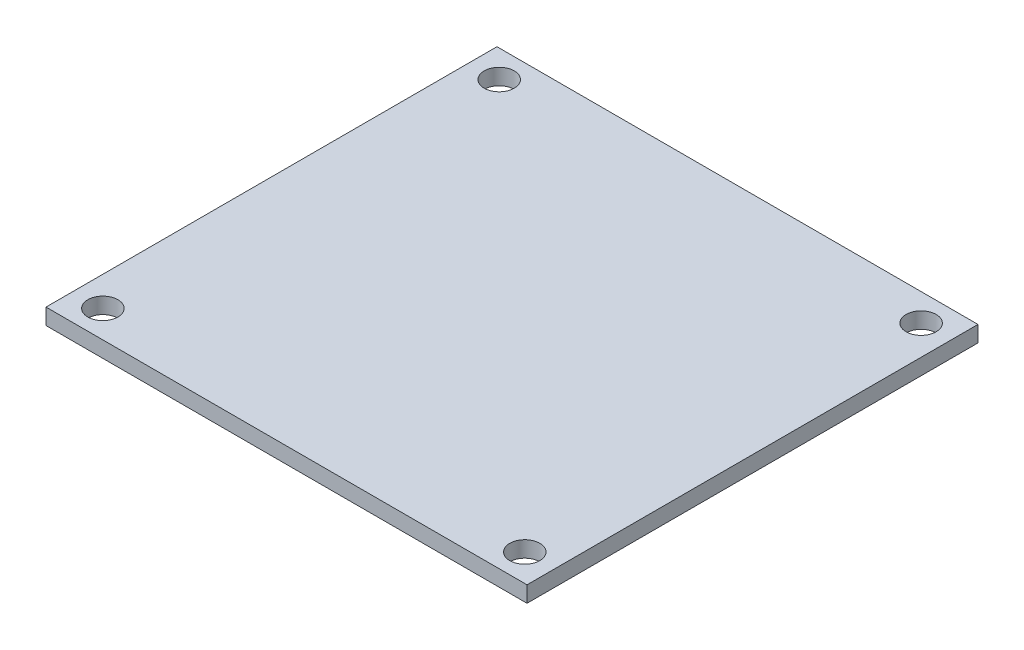
ISO-10303-21;
HEADER;
FILE_DESCRIPTION(('STEP AP214'),'2;1');
FILE_NAME('part.step','',(''),(''),'','','');
FILE_SCHEMA(('AUTOMOTIVE_DESIGN { 1 0 10303 214 1 1 1 1 }'));
ENDSEC;
DATA;
#1=APPLICATION_CONTEXT('core data for automotive mechanical design processes');
#2=APPLICATION_PROTOCOL_DEFINITION('international standard','automotive_design',2000,#1);
#3=PRODUCT_CONTEXT('',#1,'mechanical');
#4=PRODUCT('Part','Part','',(#3));
#5=PRODUCT_RELATED_PRODUCT_CATEGORY('part','',(#4));
#6=PRODUCT_DEFINITION_FORMATION('','',#4);
#7=PRODUCT_DEFINITION_CONTEXT('part definition',#1,'design');
#8=PRODUCT_DEFINITION('design','',#6,#7);
#9=PRODUCT_DEFINITION_SHAPE('','',#8);
#10=(LENGTH_UNIT() NAMED_UNIT(*) SI_UNIT(.MILLI.,.METRE.));
#11=(NAMED_UNIT(*) PLANE_ANGLE_UNIT() SI_UNIT($,.RADIAN.));
#12=(NAMED_UNIT(*) SI_UNIT($,.STERADIAN.) SOLID_ANGLE_UNIT());
#13=UNCERTAINTY_MEASURE_WITH_UNIT(LENGTH_MEASURE(1.E-05),#10,'distance_accuracy_value','');
#14=(GEOMETRIC_REPRESENTATION_CONTEXT(3) GLOBAL_UNCERTAINTY_ASSIGNED_CONTEXT((#13)) GLOBAL_UNIT_ASSIGNED_CONTEXT((#10,
#11,#12)) REPRESENTATION_CONTEXT('',''));
#15=CARTESIAN_POINT('',(0.,0.,0.));
#16=DIRECTION('',(0.,0.,1.));
#17=DIRECTION('',(1.,0.,0.));
#18=AXIS2_PLACEMENT_3D('',#15,#16,#17);
#19=CARTESIAN_POINT('',(0.,1.6,0.));
#20=DIRECTION('',(0.,-1.,0.));
#21=DIRECTION('',(0.,0.,-1.));
#22=AXIS2_PLACEMENT_3D('',#19,#20,#21);
#23=PLANE('',#22);
#24=DIRECTION('',(0.,0.,-1.));
#25=VECTOR('',#24,1.);
#26=CARTESIAN_POINT('',(24.,1.6,22.5));
#27=LINE('',#26,#25);
#28=CARTESIAN_POINT('',(24.,1.6,22.5));
#29=VERTEX_POINT('',#28);
#30=CARTESIAN_POINT('',(24.,1.6,-22.5));
#31=VERTEX_POINT('',#30);
#32=EDGE_CURVE('E86',#29,#31,#27,.T.);
#33=ORIENTED_EDGE('',*,*,#32,.T.);
#34=DIRECTION('',(-1.,0.,0.));
#35=VECTOR('',#34,1.);
#36=CARTESIAN_POINT('',(-24.,1.6,-22.5));
#37=LINE('',#36,#35);
#38=CARTESIAN_POINT('',(-24.,1.6,-22.5));
#39=VERTEX_POINT('',#38);
#40=EDGE_CURVE('E81',#31,#39,#37,.T.);
#41=ORIENTED_EDGE('',*,*,#40,.T.);
#42=DIRECTION('',(0.,0.,1.));
#43=VECTOR('',#42,1.);
#44=CARTESIAN_POINT('',(-24.,1.6,22.5));
#45=LINE('',#44,#43);
#46=CARTESIAN_POINT('',(-24.,1.6,22.5));
#47=VERTEX_POINT('',#46);
#48=EDGE_CURVE('E84',#39,#47,#45,.T.);
#49=ORIENTED_EDGE('',*,*,#48,.T.);
#50=DIRECTION('',(1.,0.,0.));
#51=VECTOR('',#50,1.);
#52=CARTESIAN_POINT('',(-24.,1.6,22.5));
#53=LINE('',#52,#51);
#54=EDGE_CURVE('E51',#47,#29,#53,.T.);
#55=ORIENTED_EDGE('',*,*,#54,.T.);
#56=EDGE_LOOP('',(#33,#41,#49,#55));
#57=FACE_BOUND('',#56,.T.);
#58=CARTESIAN_POINT('',(21.05,1.6,-19.775));
#59=DIRECTION('',(0.,1.,0.));
#60=DIRECTION('',(0.,0.,1.));
#61=AXIS2_PLACEMENT_3D('',#58,#59,#60);
#62=CIRCLE('',#61,1.5);
#63=CARTESIAN_POINT('',(21.05,1.6,-18.275));
#64=VERTEX_POINT('',#63);
#65=EDGE_CURVE('E101',#64,#64,#62,.T.);
#66=ORIENTED_EDGE('',*,*,#65,.F.);
#67=EDGE_LOOP('',(#66));
#68=FACE_BOUND('',#67,.T.);
#69=CARTESIAN_POINT('',(-21.05,1.6,-19.775));
#70=DIRECTION('',(0.,1.,0.));
#71=DIRECTION('',(0.,0.,1.));
#72=AXIS2_PLACEMENT_3D('',#69,#70,#71);
#73=CIRCLE('',#72,1.5);
#74=CARTESIAN_POINT('',(-21.05,1.6,-18.275));
#75=VERTEX_POINT('',#74);
#76=EDGE_CURVE('E116',#75,#75,#73,.T.);
#77=ORIENTED_EDGE('',*,*,#76,.F.);
#78=EDGE_LOOP('',(#77));
#79=FACE_BOUND('',#78,.T.);
#80=CARTESIAN_POINT('',(-21.05,1.6,19.775));
#81=DIRECTION('',(0.,1.,0.));
#82=DIRECTION('',(0.,0.,1.));
#83=AXIS2_PLACEMENT_3D('',#80,#81,#82);
#84=CIRCLE('',#83,1.5);
#85=CARTESIAN_POINT('',(-21.05,1.6,21.275));
#86=VERTEX_POINT('',#85);
#87=EDGE_CURVE('E122',#86,#86,#84,.T.);
#88=ORIENTED_EDGE('',*,*,#87,.F.);
#89=EDGE_LOOP('',(#88));
#90=FACE_BOUND('',#89,.T.);
#91=CARTESIAN_POINT('',(21.05,1.6,19.775));
#92=DIRECTION('',(0.,1.,0.));
#93=DIRECTION('',(0.,0.,1.));
#94=AXIS2_PLACEMENT_3D('',#91,#92,#93);
#95=CIRCLE('',#94,1.5);
#96=CARTESIAN_POINT('',(21.05,1.6,21.275));
#97=VERTEX_POINT('',#96);
#98=EDGE_CURVE('E128',#97,#97,#95,.T.);
#99=ORIENTED_EDGE('',*,*,#98,.F.);
#100=EDGE_LOOP('',(#99));
#101=FACE_BOUND('',#100,.T.);
#102=ADVANCED_FACE('F34',(#57,#68,#79,#90,#101),#23,.F.);
#103=CARTESIAN_POINT('',(0.,0.,0.));
#104=DIRECTION('',(0.,-1.,0.));
#105=DIRECTION('',(0.,0.,-1.));
#106=AXIS2_PLACEMENT_3D('',#103,#104,#105);
#107=PLANE('',#106);
#108=CARTESIAN_POINT('',(-21.05,0.,19.775));
#109=DIRECTION('',(0.,1.,0.));
#110=DIRECTION('',(0.,0.,1.));
#111=AXIS2_PLACEMENT_3D('',#108,#109,#110);
#112=CIRCLE('',#111,1.5);
#113=CARTESIAN_POINT('',(-21.05,0.,21.275));
#114=VERTEX_POINT('',#113);
#115=EDGE_CURVE('E125',#114,#114,#112,.T.);
#116=ORIENTED_EDGE('',*,*,#115,.T.);
#117=EDGE_LOOP('',(#116));
#118=FACE_BOUND('',#117,.T.);
#119=CARTESIAN_POINT('',(21.05,0.,-19.775));
#120=DIRECTION('',(0.,1.,0.));
#121=DIRECTION('',(0.,0.,1.));
#122=AXIS2_PLACEMENT_3D('',#119,#120,#121);
#123=CIRCLE('',#122,1.5);
#124=CARTESIAN_POINT('',(21.05,0.,-18.275));
#125=VERTEX_POINT('',#124);
#126=EDGE_CURVE('E113',#125,#125,#123,.T.);
#127=ORIENTED_EDGE('',*,*,#126,.T.);
#128=EDGE_LOOP('',(#127));
#129=FACE_BOUND('',#128,.T.);
#130=DIRECTION('',(0.,0.,-1.));
#131=VECTOR('',#130,1.);
#132=CARTESIAN_POINT('',(24.,0.,22.5));
#133=LINE('',#132,#131);
#134=CARTESIAN_POINT('',(24.,0.,22.5));
#135=VERTEX_POINT('',#134);
#136=CARTESIAN_POINT('',(24.,0.,-22.5));
#137=VERTEX_POINT('',#136);
#138=EDGE_CURVE('E98',#135,#137,#133,.T.);
#139=ORIENTED_EDGE('',*,*,#138,.F.);
#140=DIRECTION('',(1.,0.,0.));
#141=VECTOR('',#140,1.);
#142=CARTESIAN_POINT('',(-24.,0.,22.5));
#143=LINE('',#142,#141);
#144=CARTESIAN_POINT('',(-24.,0.,22.5));
#145=VERTEX_POINT('',#144);
#146=EDGE_CURVE('E74',#145,#135,#143,.T.);
#147=ORIENTED_EDGE('',*,*,#146,.F.);
#148=DIRECTION('',(0.,0.,1.));
#149=VECTOR('',#148,1.);
#150=CARTESIAN_POINT('',(-24.,0.,22.5));
#151=LINE('',#150,#149);
#152=CARTESIAN_POINT('',(-24.,0.,-22.5));
#153=VERTEX_POINT('',#152);
#154=EDGE_CURVE('E68',#153,#145,#151,.T.);
#155=ORIENTED_EDGE('',*,*,#154,.F.);
#156=DIRECTION('',(-1.,0.,0.));
#157=VECTOR('',#156,1.);
#158=CARTESIAN_POINT('',(-24.,0.,-22.5));
#159=LINE('',#158,#157);
#160=EDGE_CURVE('E90',#137,#153,#159,.T.);
#161=ORIENTED_EDGE('',*,*,#160,.F.);
#162=EDGE_LOOP('',(#139,#147,#155,#161));
#163=FACE_BOUND('',#162,.T.);
#164=CARTESIAN_POINT('',(-21.05,0.,-19.775));
#165=DIRECTION('',(0.,1.,0.));
#166=DIRECTION('',(0.,0.,1.));
#167=AXIS2_PLACEMENT_3D('',#164,#165,#166);
#168=CIRCLE('',#167,1.5);
#169=CARTESIAN_POINT('',(-21.05,0.,-18.275));
#170=VERTEX_POINT('',#169);
#171=EDGE_CURVE('E119',#170,#170,#168,.T.);
#172=ORIENTED_EDGE('',*,*,#171,.T.);
#173=EDGE_LOOP('',(#172));
#174=FACE_BOUND('',#173,.T.);
#175=CARTESIAN_POINT('',(21.05,0.,19.775));
#176=DIRECTION('',(0.,1.,0.));
#177=DIRECTION('',(0.,0.,1.));
#178=AXIS2_PLACEMENT_3D('',#175,#176,#177);
#179=CIRCLE('',#178,1.5);
#180=CARTESIAN_POINT('',(21.05,0.,21.275));
#181=VERTEX_POINT('',#180);
#182=EDGE_CURVE('E131',#181,#181,#179,.T.);
#183=ORIENTED_EDGE('',*,*,#182,.T.);
#184=EDGE_LOOP('',(#183));
#185=FACE_BOUND('',#184,.T.);
#186=ADVANCED_FACE('F109',(#118,#129,#163,#174,#185),#107,.T.);
#187=CARTESIAN_POINT('',(24.,1.6,22.5));
#188=DIRECTION('',(-1.,0.,0.));
#189=DIRECTION('',(0.,0.,1.));
#190=AXIS2_PLACEMENT_3D('',#187,#188,#189);
#191=PLANE('',#190);
#192=ORIENTED_EDGE('',*,*,#138,.T.);
#193=DIRECTION('',(0.,-1.,0.));
#194=VECTOR('',#193,1.);
#195=CARTESIAN_POINT('',(24.,1.6,-22.5));
#196=LINE('',#195,#194);
#197=EDGE_CURVE('E11',#31,#137,#196,.T.);
#198=ORIENTED_EDGE('',*,*,#197,.F.);
#199=ORIENTED_EDGE('',*,*,#32,.F.);
#200=DIRECTION('',(0.,-1.,0.));
#201=VECTOR('',#200,1.);
#202=CARTESIAN_POINT('',(24.,1.6,22.5));
#203=LINE('',#202,#201);
#204=EDGE_CURVE('E94',#29,#135,#203,.T.);
#205=ORIENTED_EDGE('',*,*,#204,.T.);
#206=EDGE_LOOP('',(#192,#198,#199,#205));
#207=FACE_BOUND('',#206,.T.);
#208=ADVANCED_FACE('F36',(#207),#191,.F.);
#209=CARTESIAN_POINT('',(-24.,1.6,-22.5));
#210=DIRECTION('',(0.,0.,1.));
#211=DIRECTION('',(1.,0.,0.));
#212=AXIS2_PLACEMENT_3D('',#209,#210,#211);
#213=PLANE('',#212);
#214=ORIENTED_EDGE('',*,*,#160,.T.);
#215=DIRECTION('',(0.,-1.,0.));
#216=VECTOR('',#215,1.);
#217=CARTESIAN_POINT('',(-24.,1.6,-22.5));
#218=LINE('',#217,#216);
#219=EDGE_CURVE('E43',#39,#153,#218,.T.);
#220=ORIENTED_EDGE('',*,*,#219,.F.);
#221=ORIENTED_EDGE('',*,*,#40,.F.);
#222=ORIENTED_EDGE('',*,*,#197,.T.);
#223=EDGE_LOOP('',(#214,#220,#221,#222));
#224=FACE_BOUND('',#223,.T.);
#225=ADVANCED_FACE('F89',(#224),#213,.F.);
#226=CARTESIAN_POINT('',(-24.,1.6,22.5));
#227=DIRECTION('',(1.,0.,0.));
#228=DIRECTION('',(0.,0.,-1.));
#229=AXIS2_PLACEMENT_3D('',#226,#227,#228);
#230=PLANE('',#229);
#231=ORIENTED_EDGE('',*,*,#154,.T.);
#232=DIRECTION('',(0.,-1.,0.));
#233=VECTOR('',#232,1.);
#234=CARTESIAN_POINT('',(-24.,1.6,22.5));
#235=LINE('',#234,#233);
#236=EDGE_CURVE('E91',#47,#145,#235,.T.);
#237=ORIENTED_EDGE('',*,*,#236,.F.);
#238=ORIENTED_EDGE('',*,*,#48,.F.);
#239=ORIENTED_EDGE('',*,*,#219,.T.);
#240=EDGE_LOOP('',(#231,#237,#238,#239));
#241=FACE_BOUND('',#240,.T.);
#242=ADVANCED_FACE('F92',(#241),#230,.F.);
#243=CARTESIAN_POINT('',(-24.,1.6,22.5));
#244=DIRECTION('',(0.,0.,-1.));
#245=DIRECTION('',(-1.,0.,0.));
#246=AXIS2_PLACEMENT_3D('',#243,#244,#245);
#247=PLANE('',#246);
#248=ORIENTED_EDGE('',*,*,#146,.T.);
#249=ORIENTED_EDGE('',*,*,#204,.F.);
#250=ORIENTED_EDGE('',*,*,#54,.F.);
#251=ORIENTED_EDGE('',*,*,#236,.T.);
#252=EDGE_LOOP('',(#248,#249,#250,#251));
#253=FACE_BOUND('',#252,.T.);
#254=ADVANCED_FACE('F106',(#253),#247,.F.);
#255=CARTESIAN_POINT('',(21.05,1.6,-19.775));
#256=DIRECTION('',(0.,-1.,0.));
#257=DIRECTION('',(0.,0.,-1.));
#258=AXIS2_PLACEMENT_3D('',#255,#256,#257);
#259=CYLINDRICAL_SURFACE('',#258,1.5);
#260=ORIENTED_EDGE('',*,*,#65,.T.);
#261=EDGE_LOOP('',(#260));
#262=FACE_BOUND('',#261,.T.);
#263=ORIENTED_EDGE('',*,*,#126,.F.);
#264=EDGE_LOOP('',(#263));
#265=FACE_BOUND('',#264,.T.);
#266=ADVANCED_FACE('F148',(#262,#265),#259,.F.);
#267=CARTESIAN_POINT('',(-21.05,1.6,-19.775));
#268=DIRECTION('',(0.,-1.,0.));
#269=DIRECTION('',(0.,0.,-1.));
#270=AXIS2_PLACEMENT_3D('',#267,#268,#269);
#271=CYLINDRICAL_SURFACE('',#270,1.5);
#272=ORIENTED_EDGE('',*,*,#76,.T.);
#273=EDGE_LOOP('',(#272));
#274=FACE_BOUND('',#273,.T.);
#275=ORIENTED_EDGE('',*,*,#171,.F.);
#276=EDGE_LOOP('',(#275));
#277=FACE_BOUND('',#276,.T.);
#278=ADVANCED_FACE('F194',(#274,#277),#271,.F.);
#279=CARTESIAN_POINT('',(-21.05,1.6,19.775));
#280=DIRECTION('',(0.,-1.,0.));
#281=DIRECTION('',(0.,0.,-1.));
#282=AXIS2_PLACEMENT_3D('',#279,#280,#281);
#283=CYLINDRICAL_SURFACE('',#282,1.5);
#284=ORIENTED_EDGE('',*,*,#87,.T.);
#285=EDGE_LOOP('',(#284));
#286=FACE_BOUND('',#285,.T.);
#287=ORIENTED_EDGE('',*,*,#115,.F.);
#288=EDGE_LOOP('',(#287));
#289=FACE_BOUND('',#288,.T.);
#290=ADVANCED_FACE('F202',(#286,#289),#283,.F.);
#291=CARTESIAN_POINT('',(21.05,1.6,19.775));
#292=DIRECTION('',(0.,-1.,0.));
#293=DIRECTION('',(0.,0.,-1.));
#294=AXIS2_PLACEMENT_3D('',#291,#292,#293);
#295=CYLINDRICAL_SURFACE('',#294,1.5);
#296=ORIENTED_EDGE('',*,*,#98,.T.);
#297=EDGE_LOOP('',(#296));
#298=FACE_BOUND('',#297,.T.);
#299=ORIENTED_EDGE('',*,*,#182,.F.);
#300=EDGE_LOOP('',(#299));
#301=FACE_BOUND('',#300,.T.);
#302=ADVANCED_FACE('F137',(#298,#301),#295,.F.);
#303=CLOSED_SHELL('',(#102,#186,#208,#225,#242,#254,#266,#278,#290,#302));
#304=MANIFOLD_SOLID_BREP('B2',#303);
#305=ADVANCED_BREP_SHAPE_REPRESENTATION('',(#18,#304),#14);
#306=SHAPE_DEFINITION_REPRESENTATION(#9,#305);
ENDSEC;
END-ISO-10303-21;
